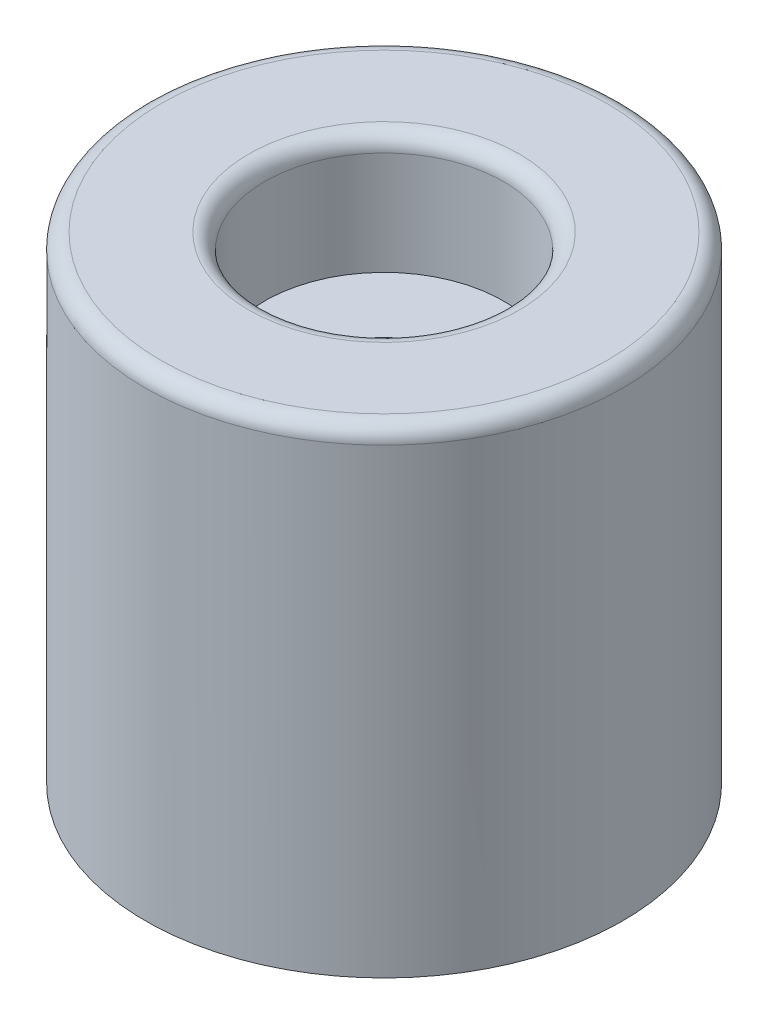
ISO-10303-21;
HEADER;
FILE_DESCRIPTION(('STEP AP214'),'2;1');
FILE_NAME('part.step','',(''),(''),'','','');
FILE_SCHEMA(('AUTOMOTIVE_DESIGN { 1 0 10303 214 1 1 1 1 }'));
ENDSEC;
DATA;
#1=APPLICATION_CONTEXT('core data for automotive mechanical design processes');
#2=APPLICATION_PROTOCOL_DEFINITION('international standard','automotive_design',2000,#1);
#3=PRODUCT_CONTEXT('',#1,'mechanical');
#4=PRODUCT('Part','Part','',(#3));
#5=PRODUCT_RELATED_PRODUCT_CATEGORY('part','',(#4));
#6=PRODUCT_DEFINITION_FORMATION('','',#4);
#7=PRODUCT_DEFINITION_CONTEXT('part definition',#1,'design');
#8=PRODUCT_DEFINITION('design','',#6,#7);
#9=PRODUCT_DEFINITION_SHAPE('','',#8);
#10=(LENGTH_UNIT() NAMED_UNIT(*) SI_UNIT(.MILLI.,.METRE.));
#11=(NAMED_UNIT(*) PLANE_ANGLE_UNIT() SI_UNIT($,.RADIAN.));
#12=(NAMED_UNIT(*) SI_UNIT($,.STERADIAN.) SOLID_ANGLE_UNIT());
#13=UNCERTAINTY_MEASURE_WITH_UNIT(LENGTH_MEASURE(1.E-05),#10,'distance_accuracy_value','');
#14=(GEOMETRIC_REPRESENTATION_CONTEXT(3) GLOBAL_UNCERTAINTY_ASSIGNED_CONTEXT((#13)) GLOBAL_UNIT_ASSIGNED_CONTEXT((#10,
#11,#12)) REPRESENTATION_CONTEXT('',''));
#15=CARTESIAN_POINT('',(0.,0.,0.));
#16=DIRECTION('',(0.,0.,1.));
#17=DIRECTION('',(1.,0.,0.));
#18=AXIS2_PLACEMENT_3D('',#15,#16,#17);
#19=CARTESIAN_POINT('',(0.,38.1,0.));
#20=DIRECTION('',(0.,-1.,0.));
#21=DIRECTION('',(0.,0.,-1.));
#22=AXIS2_PLACEMENT_3D('',#19,#20,#21);
#23=CYLINDRICAL_SURFACE('',#22,19.05);
#24=CARTESIAN_POINT('',(0.,36.83,0.));
#25=DIRECTION('',(0.,1.,0.));
#26=DIRECTION('',(0.,0.,1.));
#27=AXIS2_PLACEMENT_3D('',#24,#25,#26);
#28=CIRCLE('',#27,19.05);
#29=CARTESIAN_POINT('',(0.,36.83,-19.05));
#30=VERTEX_POINT('',#29);
#31=EDGE_CURVE('E10',#30,#30,#28,.F.);
#32=CARTESIAN_POINT('',(0.,0.,0.));
#33=DIRECTION('',(0.,1.,0.));
#34=DIRECTION('',(0.,0.,1.));
#35=AXIS2_PLACEMENT_3D('',#32,#33,#34);
#36=CIRCLE('',#35,19.05);
#37=CARTESIAN_POINT('',(0.,0.,-19.05));
#38=VERTEX_POINT('',#37);
#39=EDGE_CURVE('E52',#38,#38,#36,.T.);
#40=CARTESIAN_POINT('',(0.,36.83,-19.05));
#41=CARTESIAN_POINT('',(0.,36.4463541666667,-19.05));
#42=CARTESIAN_POINT('',(0.,36.0627083333333,-19.05));
#43=CARTESIAN_POINT('',(0.,35.2954166666667,-19.05));
#44=CARTESIAN_POINT('',(0.,34.9117708333333,-19.05));
#45=CARTESIAN_POINT('',(0.,34.1444791666667,-19.05));
#46=CARTESIAN_POINT('',(0.,33.7608333333333,-19.05));
#47=CARTESIAN_POINT('',(0.,32.9935416666667,-19.05));
#48=CARTESIAN_POINT('',(0.,32.6098958333333,-19.05));
#49=CARTESIAN_POINT('',(0.,31.8426041666667,-19.05));
#50=CARTESIAN_POINT('',(0.,31.4589583333333,-19.05));
#51=CARTESIAN_POINT('',(0.,30.6916666666667,-19.05));
#52=CARTESIAN_POINT('',(0.,30.3080208333333,-19.05));
#53=CARTESIAN_POINT('',(0.,29.5407291666667,-19.05));
#54=CARTESIAN_POINT('',(0.,29.1570833333333,-19.05));
#55=CARTESIAN_POINT('',(0.,28.3897916666667,-19.05));
#56=CARTESIAN_POINT('',(0.,28.0061458333333,-19.05));
#57=CARTESIAN_POINT('',(0.,27.2388541666667,-19.05));
#58=CARTESIAN_POINT('',(0.,26.8552083333333,-19.05));
#59=CARTESIAN_POINT('',(0.,26.0879166666667,-19.05));
#60=CARTESIAN_POINT('',(0.,25.7042708333333,-19.05));
#61=CARTESIAN_POINT('',(0.,24.9369791666667,-19.05));
#62=CARTESIAN_POINT('',(0.,24.5533333333333,-19.05));
#63=CARTESIAN_POINT('',(0.,23.7860416666667,-19.05));
#64=CARTESIAN_POINT('',(0.,23.4023958333333,-19.05));
#65=CARTESIAN_POINT('',(0.,22.6351041666667,-19.05));
#66=CARTESIAN_POINT('',(0.,22.2514583333333,-19.05));
#67=CARTESIAN_POINT('',(0.,21.4841666666667,-19.05));
#68=CARTESIAN_POINT('',(0.,21.1005208333333,-19.05));
#69=CARTESIAN_POINT('',(0.,20.3332291666667,-19.05));
#70=CARTESIAN_POINT('',(0.,19.9495833333333,-19.05));
#71=CARTESIAN_POINT('',(0.,19.1822916666667,-19.05));
#72=CARTESIAN_POINT('',(0.,18.7986458333333,-19.05));
#73=CARTESIAN_POINT('',(0.,18.0313541666667,-19.05));
#74=CARTESIAN_POINT('',(0.,17.6477083333333,-19.05));
#75=CARTESIAN_POINT('',(0.,16.8804166666667,-19.05));
#76=CARTESIAN_POINT('',(0.,16.4967708333333,-19.05));
#77=CARTESIAN_POINT('',(0.,15.7294791666667,-19.05));
#78=CARTESIAN_POINT('',(0.,15.3458333333333,-19.05));
#79=CARTESIAN_POINT('',(0.,14.5785416666667,-19.05));
#80=CARTESIAN_POINT('',(0.,14.1948958333333,-19.05));
#81=CARTESIAN_POINT('',(0.,13.4276041666667,-19.05));
#82=CARTESIAN_POINT('',(0.,13.0439583333333,-19.05));
#83=CARTESIAN_POINT('',(0.,12.2766666666667,-19.05));
#84=CARTESIAN_POINT('',(0.,11.8930208333333,-19.05));
#85=CARTESIAN_POINT('',(0.,11.1257291666667,-19.05));
#86=CARTESIAN_POINT('',(0.,10.7420833333333,-19.05));
#87=CARTESIAN_POINT('',(0.,9.97479166666667,-19.05));
#88=CARTESIAN_POINT('',(0.,9.59114583333333,-19.05));
#89=CARTESIAN_POINT('',(0.,8.82385416666667,-19.05));
#90=CARTESIAN_POINT('',(0.,8.44020833333333,-19.05));
#91=CARTESIAN_POINT('',(0.,7.67291666666667,-19.05));
#92=CARTESIAN_POINT('',(0.,7.28927083333333,-19.05));
#93=CARTESIAN_POINT('',(0.,6.52197916666667,-19.05));
#94=CARTESIAN_POINT('',(0.,6.13833333333333,-19.05));
#95=CARTESIAN_POINT('',(0.,5.37104166666667,-19.05));
#96=CARTESIAN_POINT('',(0.,4.98739583333334,-19.05));
#97=CARTESIAN_POINT('',(0.,4.22010416666667,-19.05));
#98=CARTESIAN_POINT('',(0.,3.83645833333333,-19.05));
#99=CARTESIAN_POINT('',(0.,3.06916666666667,-19.05));
#100=CARTESIAN_POINT('',(0.,2.68552083333333,-19.05));
#101=CARTESIAN_POINT('',(0.,1.91822916666667,-19.05));
#102=CARTESIAN_POINT('',(0.,1.53458333333333,-19.05));
#103=CARTESIAN_POINT('',(0.,0.767291666666665,-19.05));
#104=CARTESIAN_POINT('',(0.,0.383645833333332,-19.05));
#105=CARTESIAN_POINT('',(0.,0.,-19.05));
#106=B_SPLINE_CURVE_WITH_KNOTS('',3,(#40,#41,#42,#43,#44,#45,#46,#47,#48,#49,#50,#51,#52,#53,
#54,#55,#56,#57,#58,#59,#60,#61,#62,#63,#64,#65,#66,#67,#68,#69,#70,#71,#72,#73,#74,#75,#76,#77,
#78,#79,#80,#81,#82,#83,#84,#85,#86,#87,#88,#89,#90,#91,#92,#93,#94,#95,#96,#97,#98,#99,#100,
#101,#102,#103,#104,#105),.UNSPECIFIED.,.F.,.F.,(4,2,2,2,2,2,2,2,2,2,2,2,2,2,2,2,2,2,2,2,2,2,2,
2,2,2,2,2,2,2,2,2,4),(0.,1.1509375,2.301875,3.4528125,4.60375,5.7546875,6.905625,8.0565625,
9.20749999999999,10.3584375,11.509375,12.6603125,13.81125,14.9621875,16.113125,17.2640625,
18.415,19.5659375,20.716875,21.8678125,23.01875,24.1696875,25.320625,26.4715625,27.6225,
28.7734375,29.924375,31.0753125,32.22625,33.3771875,34.528125,35.6790625,36.83),.UNSPECIFIED.);
#107=EDGE_CURVE('BSEAM32',#30,#38,#106,.T.);
#108=ORIENTED_EDGE('',*,*,#31,.T.);
#109=ORIENTED_EDGE('',*,*,#39,.T.);
#110=ORIENTED_EDGE('',*,*,#107,.T.);
#111=ORIENTED_EDGE('',*,*,#107,.F.);
#112=EDGE_LOOP('',(#108,#110,#109,#111));
#113=FACE_BOUND('',#112,.T.);
#114=ADVANCED_FACE('F32',(#113),#23,.T.);
#115=CARTESIAN_POINT('',(0.,38.1,0.));
#116=DIRECTION('',(0.,1.,0.));
#117=DIRECTION('',(0.,0.,1.));
#118=AXIS2_PLACEMENT_3D('',#115,#116,#117);
#119=PLANE('',#118);
#120=CARTESIAN_POINT('',(0.,38.1,0.));
#121=DIRECTION('',(0.,1.,0.));
#122=DIRECTION('',(0.,0.,1.));
#123=AXIS2_PLACEMENT_3D('',#120,#121,#122);
#124=CIRCLE('',#123,10.795);
#125=CARTESIAN_POINT('',(0.,38.1,10.795));
#126=VERTEX_POINT('',#125);
#127=EDGE_CURVE('E39',#126,#126,#124,.F.);
#128=ORIENTED_EDGE('',*,*,#127,.T.);
#129=EDGE_LOOP('',(#128));
#130=FACE_BOUND('',#129,.T.);
#131=CARTESIAN_POINT('',(0.,38.1,0.));
#132=DIRECTION('',(0.,1.,0.));
#133=DIRECTION('',(0.,0.,1.));
#134=AXIS2_PLACEMENT_3D('',#131,#132,#133);
#135=CIRCLE('',#134,17.78);
#136=CARTESIAN_POINT('',(0.,38.1,17.78));
#137=VERTEX_POINT('',#136);
#138=EDGE_CURVE('E43',#137,#137,#135,.T.);
#139=ORIENTED_EDGE('',*,*,#138,.T.);
#140=EDGE_LOOP('',(#139));
#141=FACE_BOUND('',#140,.T.);
#142=ADVANCED_FACE('F88',(#130,#141),#119,.T.);
#143=CARTESIAN_POINT('',(0.,0.,0.));
#144=DIRECTION('',(0.,1.,0.));
#145=DIRECTION('',(0.,0.,1.));
#146=AXIS2_PLACEMENT_3D('',#143,#144,#145);
#147=PLANE('',#146);
#148=CARTESIAN_POINT('',(0.,0.,0.));
#149=DIRECTION('',(0.,1.,0.));
#150=DIRECTION('',(0.,0.,1.));
#151=AXIS2_PLACEMENT_3D('',#148,#149,#150);
#152=CIRCLE('',#151,3.175);
#153=CARTESIAN_POINT('',(0.,0.,3.175));
#154=VERTEX_POINT('',#153);
#155=EDGE_CURVE('E58',#154,#154,#152,.T.);
#156=ORIENTED_EDGE('',*,*,#155,.T.);
#157=EDGE_LOOP('',(#156));
#158=FACE_BOUND('',#157,.T.);
#159=ORIENTED_EDGE('',*,*,#39,.F.);
#160=EDGE_LOOP('',(#159));
#161=FACE_BOUND('',#160,.T.);
#162=ADVANCED_FACE('F65',(#158,#161),#147,.F.);
#163=CARTESIAN_POINT('',(0.,28.575,0.));
#164=DIRECTION('',(0.,1.,0.));
#165=DIRECTION('',(0.,0.,1.));
#166=AXIS2_PLACEMENT_3D('',#163,#164,#165);
#167=CYLINDRICAL_SURFACE('',#166,9.525);
#168=CARTESIAN_POINT('',(0.,36.83,0.));
#169=DIRECTION('',(0.,1.,0.));
#170=DIRECTION('',(0.,0.,1.));
#171=AXIS2_PLACEMENT_3D('',#168,#169,#170);
#172=CIRCLE('',#171,9.525);
#173=CARTESIAN_POINT('',(0.,36.83,9.525));
#174=VERTEX_POINT('',#173);
#175=EDGE_CURVE('E47',#174,#174,#172,.T.);
#176=ORIENTED_EDGE('',*,*,#175,.T.);
#177=EDGE_LOOP('',(#176));
#178=FACE_BOUND('',#177,.T.);
#179=CARTESIAN_POINT('',(0.,28.575,0.));
#180=DIRECTION('',(0.,1.,0.));
#181=DIRECTION('',(0.,0.,1.));
#182=AXIS2_PLACEMENT_3D('',#179,#180,#181);
#183=CIRCLE('',#182,9.525);
#184=CARTESIAN_POINT('',(0.,28.575,9.525));
#185=VERTEX_POINT('',#184);
#186=EDGE_CURVE('E55',#185,#185,#183,.T.);
#187=ORIENTED_EDGE('',*,*,#186,.F.);
#188=EDGE_LOOP('',(#187));
#189=FACE_BOUND('',#188,.T.);
#190=ADVANCED_FACE('F78',(#178,#189),#167,.F.);
#191=CARTESIAN_POINT('',(0.,28.575,0.));
#192=DIRECTION('',(0.,1.,0.));
#193=DIRECTION('',(0.,0.,1.));
#194=AXIS2_PLACEMENT_3D('',#191,#192,#193);
#195=PLANE('',#194);
#196=CARTESIAN_POINT('',(0.,28.575,0.));
#197=DIRECTION('',(0.,1.,0.));
#198=DIRECTION('',(0.,0.,1.));
#199=AXIS2_PLACEMENT_3D('',#196,#197,#198);
#200=CIRCLE('',#199,3.175);
#201=CARTESIAN_POINT('',(0.,28.575,3.175));
#202=VERTEX_POINT('',#201);
#203=EDGE_CURVE('E59',#202,#202,#200,.T.);
#204=ORIENTED_EDGE('',*,*,#203,.F.);
#205=EDGE_LOOP('',(#204));
#206=FACE_BOUND('',#205,.T.);
#207=ORIENTED_EDGE('',*,*,#186,.T.);
#208=EDGE_LOOP('',(#207));
#209=FACE_BOUND('',#208,.T.);
#210=ADVANCED_FACE('F72',(#206,#209),#195,.T.);
#211=CARTESIAN_POINT('',(0.,0.,0.));
#212=DIRECTION('',(0.,1.,0.));
#213=DIRECTION('',(0.,0.,1.));
#214=AXIS2_PLACEMENT_3D('',#211,#212,#213);
#215=CYLINDRICAL_SURFACE('',#214,3.175);
#216=CARTESIAN_POINT('',(0.,0.,3.175));
#217=CARTESIAN_POINT('',(0.,0.29765625,3.175));
#218=CARTESIAN_POINT('',(0.,0.5953125,3.175));
#219=CARTESIAN_POINT('',(0.,1.190625,3.175));
#220=CARTESIAN_POINT('',(0.,1.48828125,3.175));
#221=CARTESIAN_POINT('',(0.,2.08359375,3.175));
#222=CARTESIAN_POINT('',(0.,2.38125,3.175));
#223=CARTESIAN_POINT('',(0.,2.9765625,3.175));
#224=CARTESIAN_POINT('',(0.,3.27421875,3.175));
#225=CARTESIAN_POINT('',(0.,3.86953125,3.175));
#226=CARTESIAN_POINT('',(0.,4.1671875,3.175));
#227=CARTESIAN_POINT('',(0.,4.7625,3.175));
#228=CARTESIAN_POINT('',(0.,5.06015625,3.175));
#229=CARTESIAN_POINT('',(0.,5.65546875,3.175));
#230=CARTESIAN_POINT('',(0.,5.953125,3.175));
#231=CARTESIAN_POINT('',(0.,6.5484375,3.175));
#232=CARTESIAN_POINT('',(0.,6.84609375,3.175));
#233=CARTESIAN_POINT('',(0.,7.44140625,3.175));
#234=CARTESIAN_POINT('',(0.,7.7390625,3.175));
#235=CARTESIAN_POINT('',(0.,8.334375,3.175));
#236=CARTESIAN_POINT('',(0.,8.63203125,3.175));
#237=CARTESIAN_POINT('',(0.,9.22734375,3.175));
#238=CARTESIAN_POINT('',(0.,9.525,3.175));
#239=CARTESIAN_POINT('',(0.,10.1203125,3.175));
#240=CARTESIAN_POINT('',(0.,10.41796875,3.175));
#241=CARTESIAN_POINT('',(0.,11.01328125,3.175));
#242=CARTESIAN_POINT('',(0.,11.3109375,3.175));
#243=CARTESIAN_POINT('',(0.,11.90625,3.175));
#244=CARTESIAN_POINT('',(0.,12.20390625,3.175));
#245=CARTESIAN_POINT('',(0.,12.79921875,3.175));
#246=CARTESIAN_POINT('',(0.,13.096875,3.175));
#247=CARTESIAN_POINT('',(0.,13.6921875,3.175));
#248=CARTESIAN_POINT('',(0.,13.98984375,3.175));
#249=CARTESIAN_POINT('',(0.,14.58515625,3.175));
#250=CARTESIAN_POINT('',(0.,14.8828125,3.175));
#251=CARTESIAN_POINT('',(0.,15.478125,3.175));
#252=CARTESIAN_POINT('',(0.,15.77578125,3.175));
#253=CARTESIAN_POINT('',(0.,16.37109375,3.175));
#254=CARTESIAN_POINT('',(0.,16.66875,3.175));
#255=CARTESIAN_POINT('',(0.,17.2640625,3.175));
#256=CARTESIAN_POINT('',(0.,17.56171875,3.175));
#257=CARTESIAN_POINT('',(0.,18.15703125,3.175));
#258=CARTESIAN_POINT('',(0.,18.4546875,3.175));
#259=CARTESIAN_POINT('',(0.,19.05,3.175));
#260=CARTESIAN_POINT('',(0.,19.34765625,3.175));
#261=CARTESIAN_POINT('',(0.,19.94296875,3.175));
#262=CARTESIAN_POINT('',(0.,20.240625,3.175));
#263=CARTESIAN_POINT('',(0.,20.8359375,3.175));
#264=CARTESIAN_POINT('',(0.,21.13359375,3.175));
#265=CARTESIAN_POINT('',(0.,21.72890625,3.175));
#266=CARTESIAN_POINT('',(0.,22.0265625,3.175));
#267=CARTESIAN_POINT('',(0.,22.621875,3.175));
#268=CARTESIAN_POINT('',(0.,22.91953125,3.175));
#269=CARTESIAN_POINT('',(0.,23.51484375,3.175));
#270=CARTESIAN_POINT('',(0.,23.8125,3.175));
#271=CARTESIAN_POINT('',(0.,24.4078125,3.175));
#272=CARTESIAN_POINT('',(0.,24.70546875,3.175));
#273=CARTESIAN_POINT('',(0.,25.30078125,3.175));
#274=CARTESIAN_POINT('',(0.,25.5984375,3.175));
#275=CARTESIAN_POINT('',(0.,26.19375,3.175));
#276=CARTESIAN_POINT('',(0.,26.49140625,3.175));
#277=CARTESIAN_POINT('',(0.,27.08671875,3.175));
#278=CARTESIAN_POINT('',(0.,27.384375,3.175));
#279=CARTESIAN_POINT('',(0.,27.9796875,3.175));
#280=CARTESIAN_POINT('',(0.,28.27734375,3.175));
#281=CARTESIAN_POINT('',(0.,28.575,3.175));
#282=B_SPLINE_CURVE_WITH_KNOTS('',3,(#216,#217,#218,#219,#220,#221,#222,#223,#224,#225,#226,
#227,#228,#229,#230,#231,#232,#233,#234,#235,#236,#237,#238,#239,#240,#241,#242,#243,#244,#245,
#246,#247,#248,#249,#250,#251,#252,#253,#254,#255,#256,#257,#258,#259,#260,#261,#262,#263,#264,
#265,#266,#267,#268,#269,#270,#271,#272,#273,#274,#275,#276,#277,#278,#279,#280,#281),
.UNSPECIFIED.,.F.,.F.,(4,2,2,2,2,2,2,2,2,2,2,2,2,2,2,2,2,2,2,2,2,2,2,2,2,2,2,2,2,2,2,2,4),(0.,
0.89296875,1.7859375,2.67890625,3.571875,4.46484375,5.3578125,6.25078125,7.14375,8.03671875,
8.9296875,9.82265625,10.715625,11.60859375,12.5015625,13.39453125,14.2875,15.18046875,
16.0734375,16.96640625,17.859375,18.75234375,19.6453125,20.53828125,21.43125,22.32421875,
23.2171875,24.11015625,25.003125,25.89609375,26.7890625,27.68203125,28.575),.UNSPECIFIED.);
#283=EDGE_CURVE('BSEAM68',#154,#202,#282,.T.);
#284=ORIENTED_EDGE('',*,*,#155,.F.);
#285=ORIENTED_EDGE('',*,*,#203,.T.);
#286=ORIENTED_EDGE('',*,*,#283,.T.);
#287=ORIENTED_EDGE('',*,*,#283,.F.);
#288=EDGE_LOOP('',(#284,#286,#285,#287));
#289=FACE_BOUND('',#288,.T.);
#290=ADVANCED_FACE('F68',(#289),#215,.F.);
#291=CARTESIAN_POINT('',(0.,36.83,0.));
#292=DIRECTION('',(0.,1.,0.));
#293=DIRECTION('',(0.,0.,1.));
#294=AXIS2_PLACEMENT_3D('',#291,#292,#293);
#295=TOROIDAL_SURFACE('',#294,10.795,1.27);
#296=ORIENTED_EDGE('',*,*,#127,.F.);
#297=EDGE_LOOP('',(#296));
#298=FACE_BOUND('',#297,.T.);
#299=ORIENTED_EDGE('',*,*,#175,.F.);
#300=EDGE_LOOP('',(#299));
#301=FACE_BOUND('',#300,.T.);
#302=ADVANCED_FACE('F71',(#298,#301),#295,.T.);
#303=CARTESIAN_POINT('',(0.,36.83,0.));
#304=DIRECTION('',(0.,1.,0.));
#305=DIRECTION('',(0.,0.,1.));
#306=AXIS2_PLACEMENT_3D('',#303,#304,#305);
#307=TOROIDAL_SURFACE('',#306,17.78,1.27);
#308=ORIENTED_EDGE('',*,*,#31,.F.);
#309=EDGE_LOOP('',(#308));
#310=FACE_BOUND('',#309,.T.);
#311=ORIENTED_EDGE('',*,*,#138,.F.);
#312=EDGE_LOOP('',(#311));
#313=FACE_BOUND('',#312,.T.);
#314=ADVANCED_FACE('F34',(#310,#313),#307,.T.);
#315=CLOSED_SHELL('',(#114,#142,#162,#190,#210,#290,#302,#314));
#316=MANIFOLD_SOLID_BREP('B2',#315);
#317=ADVANCED_BREP_SHAPE_REPRESENTATION('',(#18,#316),#14);
#318=SHAPE_DEFINITION_REPRESENTATION(#9,#317);
ENDSEC;
END-ISO-10303-21;
